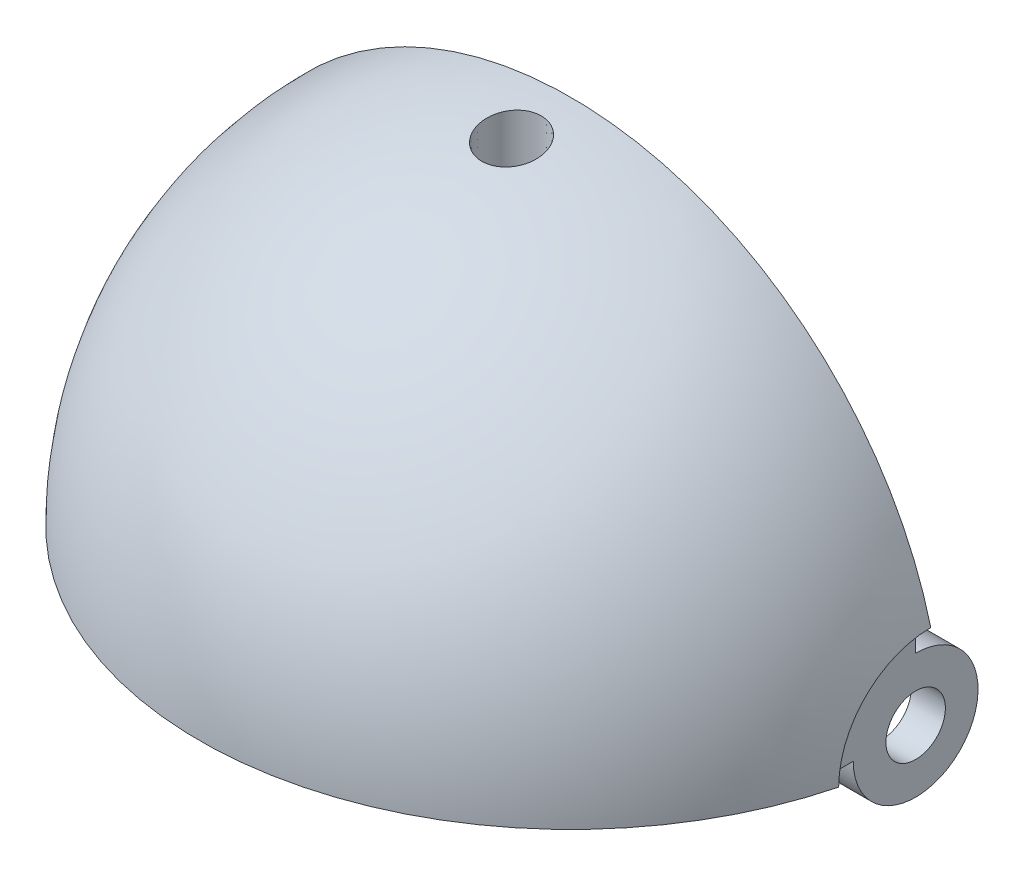
ISO-10303-21;
HEADER;
FILE_DESCRIPTION(('STEP AP214'),'2;1');
FILE_NAME('part.step','',(''),(''),'','','');
FILE_SCHEMA(('AUTOMOTIVE_DESIGN { 1 0 10303 214 1 1 1 1 }'));
ENDSEC;
DATA;
#1=APPLICATION_CONTEXT('core data for automotive mechanical design processes');
#2=APPLICATION_PROTOCOL_DEFINITION('international standard','automotive_design',2000,#1);
#3=PRODUCT_CONTEXT('',#1,'mechanical');
#4=PRODUCT('Part','Part','',(#3));
#5=PRODUCT_RELATED_PRODUCT_CATEGORY('part','',(#4));
#6=PRODUCT_DEFINITION_FORMATION('','',#4);
#7=PRODUCT_DEFINITION_CONTEXT('part definition',#1,'design');
#8=PRODUCT_DEFINITION('design','',#6,#7);
#9=PRODUCT_DEFINITION_SHAPE('','',#8);
#10=(LENGTH_UNIT() NAMED_UNIT(*) SI_UNIT(.MILLI.,.METRE.));
#11=(NAMED_UNIT(*) PLANE_ANGLE_UNIT() SI_UNIT($,.RADIAN.));
#12=(NAMED_UNIT(*) SI_UNIT($,.STERADIAN.) SOLID_ANGLE_UNIT());
#13=UNCERTAINTY_MEASURE_WITH_UNIT(LENGTH_MEASURE(1.E-05),#10,'distance_accuracy_value','');
#14=(GEOMETRIC_REPRESENTATION_CONTEXT(3) GLOBAL_UNCERTAINTY_ASSIGNED_CONTEXT((#13)) GLOBAL_UNIT_ASSIGNED_CONTEXT((#10,
#11,#12)) REPRESENTATION_CONTEXT('',''));
#15=CARTESIAN_POINT('',(0.,0.,0.));
#16=DIRECTION('',(0.,0.,1.));
#17=DIRECTION('',(1.,0.,0.));
#18=AXIS2_PLACEMENT_3D('',#15,#16,#17);
#19=CARTESIAN_POINT('',(0.,0.,0.));
#20=DIRECTION('',(-1.,0.,0.));
#21=DIRECTION('',(0.,0.,1.));
#22=AXIS2_PLACEMENT_3D('',#19,#20,#21);
#23=SPHERICAL_SURFACE('',#22,10.5);
#24=CARTESIAN_POINT('',(-10.4522724801834,0.,0.));
#25=DIRECTION('',(1.,0.,0.));
#26=DIRECTION('',(0.,0.,-1.));
#27=AXIS2_PLACEMENT_3D('',#24,#25,#26);
#28=CIRCLE('',#27,1.);
#29=CARTESIAN_POINT('',(-10.4522724801834,0.,-1.));
#30=VERTEX_POINT('',#29);
#31=EDGE_CURVE('E130',#30,#30,#28,.F.);
#32=ORIENTED_EDGE('',*,*,#31,.T.);
#33=EDGE_LOOP('',(#32));
#34=FACE_BOUND('',#33,.T.);
#35=CARTESIAN_POINT('',(0.,0.,0.));
#36=DIRECTION('',(0.,0.,-1.));
#37=DIRECTION('',(-1.,0.,0.));
#38=AXIS2_PLACEMENT_3D('',#35,#36,#37);
#39=CIRCLE('',#38,10.5);
#40=CARTESIAN_POINT('',(-10.2878569196893,2.10000000000001,0.));
#41=VERTEX_POINT('',#40);
#42=CARTESIAN_POINT('',(10.2878569196893,2.1,0.));
#43=VERTEX_POINT('',#42);
#44=EDGE_CURVE('E184',#41,#43,#39,.T.);
#45=ORIENTED_EDGE('',*,*,#44,.T.);
#46=CARTESIAN_POINT('',(10.2878569196893,0.,0.));
#47=DIRECTION('',(-1.,0.,0.));
#48=DIRECTION('',(0.,0.,1.));
#49=AXIS2_PLACEMENT_3D('',#46,#47,#48);
#50=CIRCLE('',#49,2.1);
#51=CARTESIAN_POINT('',(10.2878569196893,0.,2.1));
#52=VERTEX_POINT('',#51);
#53=EDGE_CURVE('E121',#43,#52,#50,.T.);
#54=ORIENTED_EDGE('',*,*,#53,.T.);
#55=CARTESIAN_POINT('',(0.,0.,0.));
#56=DIRECTION('',(0.,1.,0.));
#57=DIRECTION('',(-1.,0.,0.));
#58=AXIS2_PLACEMENT_3D('',#55,#56,#57);
#59=CIRCLE('',#58,10.5);
#60=CARTESIAN_POINT('',(-10.2878569196893,0.,2.10000000000001));
#61=VERTEX_POINT('',#60);
#62=EDGE_CURVE('E192',#61,#52,#59,.T.);
#63=ORIENTED_EDGE('',*,*,#62,.F.);
#64=CARTESIAN_POINT('',(-10.2878569196893,0.,0.));
#65=DIRECTION('',(1.,0.,0.));
#66=DIRECTION('',(0.,0.,-1.));
#67=AXIS2_PLACEMENT_3D('',#64,#65,#66);
#68=CIRCLE('',#67,2.1);
#69=EDGE_CURVE('E145',#41,#61,#68,.F.);
#70=ORIENTED_EDGE('',*,*,#69,.F.);
#71=EDGE_LOOP('',(#45,#54,#63,#70));
#72=FACE_BOUND('',#71,.T.);
#73=CARTESIAN_POINT('',(-0.728106991383491,10.3919129125039,1.31453649910791));
#74=CARTESIAN_POINT('',(-0.652307894969961,10.4074085480079,1.23402185176722));
#75=CARTESIAN_POINT('',(-0.561478176959268,10.4206443778854,1.16506705069624));
#76=CARTESIAN_POINT('',(-0.462887339683849,10.4305162135101,1.11358287992593));
#77=CARTESIAN_POINT('',(-0.364250911716371,10.4403926141008,1.06207490167979));
#78=CARTESIAN_POINT('',(-0.255100754894366,10.4471707095871,1.0266584289002));
#79=CARTESIAN_POINT('',(-0.14460436657346,10.4502611553673,1.01051044615525));
#80=CARTESIAN_POINT('',(-0.0352462698286744,10.4533197645559,0.994528813759015));
#81=CARTESIAN_POINT('',(0.0784601077623633,10.4528513834104,0.996978399371696));
#82=CARTESIAN_POINT('',(0.187002250838111,10.4488964939289,1.01764051479029));
#83=CARTESIAN_POINT('',(0.294964791327733,10.4449627231033,1.03819229688405));
#84=CARTESIAN_POINT('',(0.40077209243451,10.4374752988036,1.0773044496522));
#85=CARTESIAN_POINT('',(0.49584374268873,10.4270632028023,1.13158824119175));
#86=CARTESIAN_POINT('',(0.591491796704003,10.4165879799774,1.18620114642108));
#87=CARTESIAN_POINT('',(0.678870264824768,10.4028728288386,1.257621930668));
#88=CARTESIAN_POINT('',(0.751153575061501,10.387035668128,1.33987250725915));
#89=CARTESIAN_POINT('',(0.824512692668293,10.370962799698,1.4233472360951));
#90=CARTESIAN_POINT('',(0.884316341849243,10.3522731418889,1.52020831824258));
#91=CARTESIAN_POINT('',(0.926032704922112,10.3324621034353,1.62255672026828));
#92=CARTESIAN_POINT('',(0.968485093323489,10.3123015276536,1.72671091289207));
#93=CARTESIAN_POINT('',(0.993366785577458,10.2904329065453,1.83936667772853));
#94=CARTESIAN_POINT('',(0.998818202739425,10.2686128463832,1.9513975527737));
#95=CARTESIAN_POINT('',(1.00434101290862,10.2465070257175,2.06489560980735));
#96=CARTESIAN_POINT('',(0.990065393039273,10.2238424898462,2.18087510830186));
#97=CARTESIAN_POINT('',(0.957096018081167,10.2024955839191,2.28977096502786));
#98=CARTESIAN_POINT('',(0.924037202652325,10.1810907673607,2.39896223823352));
#99=CARTESIAN_POINT('',(0.871233389815047,10.1604138377774,2.50408003289963));
#100=CARTESIAN_POINT('',(0.802887925958877,10.1422620748597,2.59613000121572));
#101=CARTESIAN_POINT('',(0.73518303123678,10.1242804396783,2.68731722948779));
#102=CARTESIAN_POINT('',(0.650283830430682,10.1082734089357,2.76824168609916));
#103=CARTESIAN_POINT('',(0.555220685184941,10.0957014483491,2.83170306645026));
#104=CARTESIAN_POINT('',(0.461833592886861,10.08335114329,2.89404556278669));
#105=CARTESIAN_POINT('',(0.355984000525044,10.0739722451506,2.94127843993011));
#106=CARTESIAN_POINT('',(0.246643601730837,10.0684445163836,2.96910625512646));
#107=CARTESIAN_POINT('',(0.139251727918253,10.0630152957408,2.99643815853091));
#108=CARTESIAN_POINT('',(0.0254927193347815,10.0611509676927,3.00581118011393));
#109=CARTESIAN_POINT('',(-0.0850379033698531,10.0630258437454,2.99637771702827));
#110=CARTESIAN_POINT('',(-0.19450173363028,10.0648826243276,2.98703530153553));
#111=CARTESIAN_POINT('',(-0.303804673664861,10.0704538227887,2.95900922300621));
#112=CARTESIAN_POINT('',(-0.403994916017502,10.079233853829,2.91476122995676));
#113=CARTESIAN_POINT('',(-0.504473767317625,10.0880391767087,2.87038577572545));
#114=CARTESIAN_POINT('',(-0.598516598907779,10.1003035548544,2.80852073071121));
#115=CARTESIAN_POINT('',(-0.678723359369432,10.1149603979634,2.73439403690817));
#116=CARTESIAN_POINT('',(-0.760043725837227,10.129820739486,2.65923815390761));
#117=CARTESIAN_POINT('',(-0.829346013003156,10.1475346495717,2.56947620439639));
#118=CARTESIAN_POINT('',(-0.881354642215588,10.1666208184976,2.47245528322269));
#119=CARTESIAN_POINT('',(-0.934329948569716,10.1860617393849,2.37363104771087));
#120=CARTESIAN_POINT('',(-0.970806752228663,10.2074493688627,2.2646108261565));
#121=CARTESIAN_POINT('',(-0.988037665081139,10.2290346073549,2.15421275038404));
#122=CARTESIAN_POINT('',(-1.00552986754891,10.2509471644697,2.04214059785226));
#123=CARTESIAN_POINT('',(-1.00366237433522,10.273663734221,1.92557565916659));
#124=CARTESIAN_POINT('',(-0.982564264138022,10.2953238476762,1.81407671786753));
#125=CARTESIAN_POINT('',(-0.961356164594484,10.3170968803311,1.70199650670326));
#126=CARTESIAN_POINT('',(-0.920102408168955,10.3384092415675,1.59191448719013));
#127=CARTESIAN_POINT('',(-0.862043349156579,10.357477405828,1.49316544694061));
#128=CARTESIAN_POINT('',(-0.824395878875781,10.3698418526433,1.42913320767785));
#129=CARTESIAN_POINT('',(-0.779224092099755,10.3814630259195,1.36883365477313));
#130=CARTESIAN_POINT('',(-0.728106991383491,10.3919129125039,1.31453649910791));
#131=B_SPLINE_CURVE_WITH_KNOTS('',3,(#73,#74,#75,#76,#77,#78,#79,#80,#81,#82,#83,#84,#85,#86,
#87,#88,#89,#90,#91,#92,#93,#94,#95,#96,#97,#98,#99,#100,#101,#102,#103,#104,#105,#106,#107,
#108,#109,#110,#111,#112,#113,#114,#115,#116,#117,#118,#119,#120,#121,#122,#123,#124,#125,#126,
#127,#128,#129,#130),.UNSPECIFIED.,.T.,.F.,(4,3,3,3,3,3,3,3,3,3,3,3,3,3,3,3,3,3,3,4),(0.,
0.0530700565580793,0.106180479501993,0.158732982165884,0.210990223899904,0.263558239217251,
0.316913079120219,0.371222759247795,0.426261564827187,0.481464633769087,0.536154729250473,
0.589871347885317,0.64261232979514,0.694826104049307,0.747180409163166,0.800263579831544,
0.854346072192675,0.909266985583149,0.964490403462017,1.),.UNSPECIFIED.);
#132=CARTESIAN_POINT('',(-0.728106991383491,10.3919129125039,1.31453649910791));
#133=VERTEX_POINT('',#132);
#134=EDGE_CURVE('E153',#133,#133,#131,.T.);
#135=ORIENTED_EDGE('',*,*,#134,.F.);
#136=EDGE_LOOP('',(#135));
#137=FACE_BOUND('',#136,.T.);
#138=CARTESIAN_POINT('',(10.4522724801834,0.,0.));
#139=DIRECTION('',(-1.,0.,0.));
#140=DIRECTION('',(0.,0.,1.));
#141=AXIS2_PLACEMENT_3D('',#138,#139,#140);
#142=CIRCLE('',#141,1.);
#143=CARTESIAN_POINT('',(10.4522724801834,0.,1.));
#144=VERTEX_POINT('',#143);
#145=EDGE_CURVE('E111',#144,#144,#142,.T.);
#146=ORIENTED_EDGE('',*,*,#145,.F.);
#147=EDGE_LOOP('',(#146));
#148=FACE_BOUND('',#147,.T.);
#149=ADVANCED_FACE('F33',(#34,#72,#137,#148),#23,.F.);
#150=CARTESIAN_POINT('',(0.,0.,0.));
#151=DIRECTION('',(0.,1.,0.));
#152=DIRECTION('',(-1.,0.,0.));
#153=AXIS2_PLACEMENT_3D('',#150,#151,#152);
#154=PLANE('',#153);
#155=DIRECTION('',(1.,0.,0.));
#156=VECTOR('',#155,1.);
#157=CARTESIAN_POINT('',(-12.1105004025765,0.,2.1));
#158=LINE('',#157,#156);
#159=CARTESIAN_POINT('',(11.6,0.,2.1));
#160=VERTEX_POINT('',#159);
#161=EDGE_CURVE('E116',#52,#160,#158,.T.);
#162=ORIENTED_EDGE('',*,*,#161,.T.);
#163=DIRECTION('',(0.,0.,1.));
#164=VECTOR('',#163,1.);
#165=CARTESIAN_POINT('',(11.6,0.,0.));
#166=LINE('',#165,#164);
#167=CARTESIAN_POINT('',(11.6,0.,3.1));
#168=VERTEX_POINT('',#167);
#169=EDGE_CURVE('E108',#160,#168,#166,.T.);
#170=ORIENTED_EDGE('',*,*,#169,.T.);
#171=DIRECTION('',(1.,0.,0.));
#172=VECTOR('',#171,1.);
#173=CARTESIAN_POINT('',(-20.3681240867132,0.,3.1));
#174=LINE('',#173,#172);
#175=CARTESIAN_POINT('',(12.1095004025765,0.,3.1));
#176=VERTEX_POINT('',#175);
#177=EDGE_CURVE('E98',#168,#176,#174,.T.);
#178=ORIENTED_EDGE('',*,*,#177,.T.);
#179=CARTESIAN_POINT('',(0.,0.,0.));
#180=DIRECTION('',(0.,-1.,0.));
#181=DIRECTION('',(-1.,0.,0.));
#182=AXIS2_PLACEMENT_3D('',#179,#180,#181);
#183=CIRCLE('',#182,12.5);
#184=CARTESIAN_POINT('',(-12.1095004025765,0.,3.1));
#185=VERTEX_POINT('',#184);
#186=EDGE_CURVE('E56',#176,#185,#183,.T.);
#187=ORIENTED_EDGE('',*,*,#186,.T.);
#188=DIRECTION('',(-1.,0.,0.));
#189=VECTOR('',#188,1.);
#190=CARTESIAN_POINT('',(-2.83187591328681,0.,3.1));
#191=LINE('',#190,#189);
#192=CARTESIAN_POINT('',(-11.6,0.,3.1));
#193=VERTEX_POINT('',#192);
#194=EDGE_CURVE('E143',#193,#185,#191,.T.);
#195=ORIENTED_EDGE('',*,*,#194,.F.);
#196=DIRECTION('',(0.,0.,-1.));
#197=VECTOR('',#196,1.);
#198=CARTESIAN_POINT('',(-11.6,0.,0.));
#199=LINE('',#198,#197);
#200=CARTESIAN_POINT('',(-11.6,0.,2.1));
#201=VERTEX_POINT('',#200);
#202=EDGE_CURVE('E136',#193,#201,#199,.T.);
#203=ORIENTED_EDGE('',*,*,#202,.T.);
#204=DIRECTION('',(-1.,0.,0.));
#205=VECTOR('',#204,1.);
#206=CARTESIAN_POINT('',(12.501,0.,2.1));
#207=LINE('',#206,#205);
#208=EDGE_CURVE('E150',#61,#201,#207,.T.);
#209=ORIENTED_EDGE('',*,*,#208,.F.);
#210=ORIENTED_EDGE('',*,*,#62,.T.);
#211=EDGE_LOOP('',(#162,#170,#178,#187,#195,#203,#209,#210));
#212=FACE_BOUND('',#211,.T.);
#213=ADVANCED_FACE('F114',(#212),#154,.F.);
#214=CARTESIAN_POINT('',(0.,0.,0.));
#215=DIRECTION('',(0.,0.,-1.));
#216=DIRECTION('',(-1.,0.,0.));
#217=AXIS2_PLACEMENT_3D('',#214,#215,#216);
#218=PLANE('',#217);
#219=DIRECTION('',(0.,1.,0.));
#220=VECTOR('',#219,1.);
#221=CARTESIAN_POINT('',(11.6,0.,0.));
#222=LINE('',#221,#220);
#223=CARTESIAN_POINT('',(11.6,2.1,0.));
#224=VERTEX_POINT('',#223);
#225=CARTESIAN_POINT('',(11.6,3.1,0.));
#226=VERTEX_POINT('',#225);
#227=EDGE_CURVE('E110',#224,#226,#222,.T.);
#228=ORIENTED_EDGE('',*,*,#227,.F.);
#229=DIRECTION('',(1.,0.,0.));
#230=VECTOR('',#229,1.);
#231=CARTESIAN_POINT('',(-12.1105004025765,2.1,0.));
#232=LINE('',#231,#230);
#233=EDGE_CURVE('E124',#43,#224,#232,.T.);
#234=ORIENTED_EDGE('',*,*,#233,.F.);
#235=ORIENTED_EDGE('',*,*,#44,.F.);
#236=DIRECTION('',(-1.,0.,0.));
#237=VECTOR('',#236,1.);
#238=CARTESIAN_POINT('',(12.501,2.1,0.));
#239=LINE('',#238,#237);
#240=CARTESIAN_POINT('',(-11.6,2.1,0.));
#241=VERTEX_POINT('',#240);
#242=EDGE_CURVE('E195',#41,#241,#239,.T.);
#243=ORIENTED_EDGE('',*,*,#242,.T.);
#244=DIRECTION('',(0.,-1.,0.));
#245=VECTOR('',#244,1.);
#246=CARTESIAN_POINT('',(-11.6,0.,0.));
#247=LINE('',#246,#245);
#248=CARTESIAN_POINT('',(-11.6,3.1,0.));
#249=VERTEX_POINT('',#248);
#250=EDGE_CURVE('E137',#249,#241,#247,.T.);
#251=ORIENTED_EDGE('',*,*,#250,.F.);
#252=DIRECTION('',(-1.,0.,0.));
#253=VECTOR('',#252,1.);
#254=CARTESIAN_POINT('',(-2.83187591328681,3.1,0.));
#255=LINE('',#254,#253);
#256=CARTESIAN_POINT('',(-12.1095004025765,3.1,0.));
#257=VERTEX_POINT('',#256);
#258=EDGE_CURVE('E139',#249,#257,#255,.T.);
#259=ORIENTED_EDGE('',*,*,#258,.T.);
#260=CARTESIAN_POINT('',(0.,0.,0.));
#261=DIRECTION('',(0.,0.,1.));
#262=DIRECTION('',(-1.,0.,0.));
#263=AXIS2_PLACEMENT_3D('',#260,#261,#262);
#264=CIRCLE('',#263,12.5);
#265=CARTESIAN_POINT('',(12.1095004025765,3.1,0.));
#266=VERTEX_POINT('',#265);
#267=EDGE_CURVE('E190',#266,#257,#264,.T.);
#268=ORIENTED_EDGE('',*,*,#267,.F.);
#269=DIRECTION('',(1.,0.,0.));
#270=VECTOR('',#269,1.);
#271=CARTESIAN_POINT('',(-20.3681240867132,3.1,0.));
#272=LINE('',#271,#270);
#273=EDGE_CURVE('E49',#226,#266,#272,.T.);
#274=ORIENTED_EDGE('',*,*,#273,.F.);
#275=EDGE_LOOP('',(#228,#234,#235,#243,#251,#259,#268,#274));
#276=FACE_BOUND('',#275,.T.);
#277=ADVANCED_FACE('F213',(#276),#218,.T.);
#278=CARTESIAN_POINT('',(0.,0.,0.));
#279=DIRECTION('',(-1.,0.,0.));
#280=DIRECTION('',(0.,0.,1.));
#281=AXIS2_PLACEMENT_3D('',#278,#279,#280);
#282=SPHERICAL_SURFACE('',#281,12.5);
#283=CARTESIAN_POINT('',(-0.728106991383491,12.4093454300221,1.31453649910791));
#284=CARTESIAN_POINT('',(-0.689899610551344,12.415884066346,1.27397222106609));
#285=CARTESIAN_POINT('',(-0.648173094268771,12.4219102592478,1.23659496825361));
#286=CARTESIAN_POINT('',(-0.55906422900722,12.4327709178177,1.16910693265255));
#287=CARTESIAN_POINT('',(-0.511680254296422,12.437605039702,1.13899824611258));
#288=CARTESIAN_POINT('',(-0.412353040336046,12.4459224410411,1.08725928283271));
#289=CARTESIAN_POINT('',(-0.360408103724934,12.4494052149565,1.06563217902059));
#290=CARTESIAN_POINT('',(-0.253617181376355,12.4549390148278,1.03117765100777));
#291=CARTESIAN_POINT('',(-0.198771911710647,12.4569903924264,1.01834806558646));
#292=CARTESIAN_POINT('',(-0.0880748302830937,12.4595619958497,1.00232909902844));
#293=CARTESIAN_POINT('',(-0.0322335871521187,12.4600935361527,0.99906847660882));
#294=CARTESIAN_POINT('',(0.0792285518691048,12.4596729101595,1.00168931687051));
#295=CARTESIAN_POINT('',(0.134849447157652,12.4587207398146,1.00757080449886));
#296=CARTESIAN_POINT('',(0.244026953620121,12.4553371718485,1.02864408920243));
#297=CARTESIAN_POINT('',(0.29759072297998,12.4529115153133,1.04379975334889));
#298=CARTESIAN_POINT('',(0.401479612173663,12.4466845138338,1.08256293164331));
#299=CARTESIAN_POINT('',(0.451804702289858,12.4428831562684,1.10617052333183));
#300=CARTESIAN_POINT('',(0.54787093879884,12.4339715811213,1.16159203959725));
#301=CARTESIAN_POINT('',(0.593591699324328,12.4288558707922,1.19344040686471));
#302=CARTESIAN_POINT('',(0.679170972209115,12.4174877254039,1.26405528920664));
#303=CARTESIAN_POINT('',(0.719029208219901,12.4112352367902,1.30282213021457));
#304=CARTESIAN_POINT('',(0.791955136214635,12.3976848427621,1.38686393646583));
#305=CARTESIAN_POINT('',(0.824946710240552,12.3903765991633,1.4322032784376));
#306=CARTESIAN_POINT('',(0.883027295346548,12.3749738947431,1.52756693650976));
#307=CARTESIAN_POINT('',(0.908115775086694,12.3668793811072,1.57759156731775));
#308=CARTESIAN_POINT('',(0.949678259099593,12.3500255371919,1.68173552125069));
#309=CARTESIAN_POINT('',(0.966041112847829,12.3412591840371,1.73589807290691));
#310=CARTESIAN_POINT('',(0.989601124777249,12.3233826805889,1.84612721237754));
#311=CARTESIAN_POINT('',(0.996797758090051,12.3142725106389,1.90219390903679));
#312=CARTESIAN_POINT('',(1.00149571275093,12.2958998811178,2.01523360381635));
#313=CARTESIAN_POINT('',(0.998908133164669,12.2866367902316,2.07221020549165));
#314=CARTESIAN_POINT('',(0.984287818216278,12.2682685782145,2.18496681495122));
#315=CARTESIAN_POINT('',(0.972254859888823,12.2591634608179,2.2407467944564));
#316=CARTESIAN_POINT('',(0.938649775224896,12.2414018079302,2.34954132258098));
#317=CARTESIAN_POINT('',(0.917061065192044,12.2327460816496,2.402550883623));
#318=CARTESIAN_POINT('',(0.865288659641871,12.2160976013223,2.50430880913818));
#319=CARTESIAN_POINT('',(0.835105177423509,12.2081048308292,2.55305727932083));
#320=CARTESIAN_POINT('',(0.766844266202561,12.1931417448155,2.64433857605511));
#321=CARTESIAN_POINT('',(0.728820491320502,12.1861650028076,2.68691046310065));
#322=CARTESIAN_POINT('',(0.646122966377359,12.173306844395,2.76521406180111));
#323=CARTESIAN_POINT('',(0.601449648074106,12.1674253569306,2.80094621721878));
#324=CARTESIAN_POINT('',(0.507038350238937,12.1570958445774,2.86376235057631));
#325=CARTESIAN_POINT('',(0.457369112855797,12.1526311431459,2.89094690191247));
#326=CARTESIAN_POINT('',(0.354139426302769,12.1450857408511,2.93678062576638));
#327=CARTESIAN_POINT('',(0.300579268297489,12.142004936552,2.95543043619337));
#328=CARTESIAN_POINT('',(0.191659847653857,12.1374548535898,2.98304861424364));
#329=CARTESIAN_POINT('',(0.13633100767732,12.135966125469,2.99213380530917));
#330=CARTESIAN_POINT('',(0.0249140844680925,12.1344809453725,3.00114568263772));
#331=CARTESIAN_POINT('',(-0.0311739619784159,12.1344844213513,3.00107281106355));
#332=CARTESIAN_POINT('',(-0.142116136804545,12.1360774388554,2.991405613831));
#333=CARTESIAN_POINT('',(-0.196976049598955,12.1376562376509,2.98187578121465));
#334=CARTESIAN_POINT('',(-0.304365833323193,12.1422382561654,2.95406388345172));
#335=CARTESIAN_POINT('',(-0.356895712168634,12.1452414710449,2.93578184804069));
#336=CARTESIAN_POINT('',(-0.458126920244492,12.1526761844285,2.89061804615184));
#337=CARTESIAN_POINT('',(-0.506820860889904,12.157110359339,2.86372016567114));
#338=CARTESIAN_POINT('',(-0.599117041600928,12.167185043795,2.80245619165245));
#339=CARTESIAN_POINT('',(-0.642719059812294,12.1728256058724,2.76808977289794));
#340=CARTESIAN_POINT('',(-0.723820467898995,12.1852809748719,2.69224115097837));
#341=CARTESIAN_POINT('',(-0.761257432008704,12.1921065073881,2.65069396897165));
#342=CARTESIAN_POINT('',(-0.828796418647627,12.2066230486477,2.56214832865606));
#343=CARTESIAN_POINT('',(-0.85889793681649,12.2143141168493,2.51514949583793));
#344=CARTESIAN_POINT('',(-0.911015352438692,12.2305064314308,2.41619472566527));
#345=CARTESIAN_POINT('',(-0.932921426975097,12.2390168843567,2.36418244777759));
#346=CARTESIAN_POINT('',(-0.967860330347143,12.2564656731408,2.25732845223746));
#347=CARTESIAN_POINT('',(-0.980892934750528,12.2654040198153,2.20248666305734));
#348=CARTESIAN_POINT('',(-0.997479854750457,12.2835971034336,2.09083201973493));
#349=CARTESIAN_POINT('',(-1.00093287854682,12.2928541814051,2.03400448780989));
#350=CARTESIAN_POINT('',(-0.998353945094159,12.3113010028108,1.92053719231382));
#351=CARTESIAN_POINT('',(-0.992319358972978,12.3204907268734,1.86389748514424));
#352=CARTESIAN_POINT('',(-0.970499021284551,12.3386008373284,1.75225340936501));
#353=CARTESIAN_POINT('',(-0.954675751143951,12.3475200482414,1.69725619044849));
#354=CARTESIAN_POINT('',(-0.91402331664227,12.3647826864806,1.59060897525168));
#355=CARTESIAN_POINT('',(-0.88919829526075,12.3731263765862,1.53895745201201));
#356=CARTESIAN_POINT('',(-0.841408005010492,12.386146707887,1.45834525805561));
#357=CARTESIAN_POINT('',(-0.820976685075921,12.3910641669102,1.42789738919229));
#358=CARTESIAN_POINT('',(-0.776908063611606,12.4005103203657,1.369351041479));
#359=CARTESIAN_POINT('',(-0.753270771155419,12.405039015898,1.34125255598016));
#360=CARTESIAN_POINT('',(-0.728106991383491,12.4093454300221,1.31453649910791));
#361=B_SPLINE_CURVE_WITH_KNOTS('',3,(#283,#284,#285,#286,#287,#288,#289,#290,#291,#292,#293,
#294,#295,#296,#297,#298,#299,#300,#301,#302,#303,#304,#305,#306,#307,#308,#309,#310,#311,#312,
#313,#314,#315,#316,#317,#318,#319,#320,#321,#322,#323,#324,#325,#326,#327,#328,#329,#330,#331,
#332,#333,#334,#335,#336,#337,#338,#339,#340,#341,#342,#343,#344,#345,#346,#347,#348,#349,#350,
#351,#352,#353,#354,#355,#356,#357,#358,#359,#360),.UNSPECIFIED.,.T.,.F.,(4,2,2,2,2,2,2,2,2,2,2,
2,2,2,2,2,2,2,2,2,2,2,2,2,2,2,2,2,2,2,2,2,2,2,2,2,2,2,4),(0.,0.168202618158534,
0.336453688018412,0.504767640058224,0.67304022883962,0.840056803397201,1.00707383371123,
1.17344425918152,1.33981621102398,1.50689508131306,1.67398182486735,1.84283223989981,
2.01169400464243,2.18265830904687,2.35363240262504,2.52616371139558,2.69869909302093,
2.87153508542734,3.04436678888646,3.21605281650582,3.38772770133348,3.55729967309864,
3.72685896853259,3.89432232840623,4.06177760294096,4.22809868723908,4.39441920646646,
4.56105262515407,4.72769330132652,4.89592945722275,5.06417717720408,5.23460495824474,
5.4050370496702,5.57726449617931,5.74953967270101,5.9224792808756,6.09533939587977,
6.20611970918993,6.31689970897577),.UNSPECIFIED.);
#362=CARTESIAN_POINT('',(-0.728106991383491,12.4093454300221,1.31453649910791));
#363=VERTEX_POINT('',#362);
#364=EDGE_CURVE('E181',#363,#363,#361,.T.);
#365=ORIENTED_EDGE('',*,*,#364,.T.);
#366=EDGE_LOOP('',(#365));
#367=FACE_BOUND('',#366,.T.);
#368=ORIENTED_EDGE('',*,*,#186,.F.);
#369=CARTESIAN_POINT('',(12.1095004025765,0.,0.));
#370=DIRECTION('',(-1.,0.,0.));
#371=DIRECTION('',(0.,0.,1.));
#372=AXIS2_PLACEMENT_3D('',#369,#370,#371);
#373=CIRCLE('',#372,3.1);
#374=EDGE_CURVE('E11',#176,#266,#373,.T.);
#375=ORIENTED_EDGE('',*,*,#374,.T.);
#376=ORIENTED_EDGE('',*,*,#267,.T.);
#377=CARTESIAN_POINT('',(-12.1095004025765,0.,0.));
#378=DIRECTION('',(1.,0.,0.));
#379=DIRECTION('',(0.,0.,-1.));
#380=AXIS2_PLACEMENT_3D('',#377,#378,#379);
#381=CIRCLE('',#380,3.1);
#382=EDGE_CURVE('E42',#185,#257,#381,.F.);
#383=ORIENTED_EDGE('',*,*,#382,.F.);
#384=EDGE_LOOP('',(#368,#375,#376,#383));
#385=FACE_BOUND('',#384,.T.);
#386=ADVANCED_FACE('F35',(#367,#385),#282,.T.);
#387=CARTESIAN_POINT('',(-0.728106991383491,10.3919129125039,1.31453649910791));
#388=CARTESIAN_POINT('',(-0.652307894969961,10.4074085480079,1.23402185176722));
#389=CARTESIAN_POINT('',(-0.561478176959268,10.4206443778854,1.16506705069624));
#390=CARTESIAN_POINT('',(-0.462887339683849,10.4305162135101,1.11358287992593));
#391=CARTESIAN_POINT('',(-0.364250911716371,10.4403926141008,1.06207490167979));
#392=CARTESIAN_POINT('',(-0.255100754894366,10.4471707095871,1.0266584289002));
#393=CARTESIAN_POINT('',(-0.14460436657346,10.4502611553673,1.01051044615525));
#394=CARTESIAN_POINT('',(-0.0352462698286744,10.4533197645559,0.994528813759015));
#395=CARTESIAN_POINT('',(0.0784601077623633,10.4528513834104,0.996978399371696));
#396=CARTESIAN_POINT('',(0.187002250838111,10.4488964939289,1.01764051479029));
#397=CARTESIAN_POINT('',(0.294964791327733,10.4449627231033,1.03819229688405));
#398=CARTESIAN_POINT('',(0.40077209243451,10.4374752988036,1.0773044496522));
#399=CARTESIAN_POINT('',(0.49584374268873,10.4270632028023,1.13158824119175));
#400=CARTESIAN_POINT('',(0.591491796704003,10.4165879799774,1.18620114642108));
#401=CARTESIAN_POINT('',(0.678870264824768,10.4028728288386,1.257621930668));
#402=CARTESIAN_POINT('',(0.751153575061501,10.387035668128,1.33987250725915));
#403=CARTESIAN_POINT('',(0.824512692668293,10.370962799698,1.4233472360951));
#404=CARTESIAN_POINT('',(0.884316341849243,10.3522731418889,1.52020831824258));
#405=CARTESIAN_POINT('',(0.926032704922112,10.3324621034353,1.62255672026828));
#406=CARTESIAN_POINT('',(0.968485093323489,10.3123015276536,1.72671091289207));
#407=CARTESIAN_POINT('',(0.993366785577458,10.2904329065453,1.83936667772853));
#408=CARTESIAN_POINT('',(0.998818202739425,10.2686128463832,1.9513975527737));
#409=CARTESIAN_POINT('',(1.00434101290862,10.2465070257175,2.06489560980735));
#410=CARTESIAN_POINT('',(0.990065393039273,10.2238424898462,2.18087510830186));
#411=CARTESIAN_POINT('',(0.957096018081167,10.2024955839191,2.28977096502786));
#412=CARTESIAN_POINT('',(0.924037202652325,10.1810907673607,2.39896223823352));
#413=CARTESIAN_POINT('',(0.871233389815047,10.1604138377774,2.50408003289963));
#414=CARTESIAN_POINT('',(0.802887925958877,10.1422620748597,2.59613000121572));
#415=CARTESIAN_POINT('',(0.73518303123678,10.1242804396783,2.68731722948779));
#416=CARTESIAN_POINT('',(0.650283830430682,10.1082734089357,2.76824168609916));
#417=CARTESIAN_POINT('',(0.555220685184941,10.0957014483491,2.83170306645026));
#418=CARTESIAN_POINT('',(0.461833592886861,10.08335114329,2.89404556278669));
#419=CARTESIAN_POINT('',(0.355984000525044,10.0739722451506,2.94127843993011));
#420=CARTESIAN_POINT('',(0.246643601730837,10.0684445163836,2.96910625512646));
#421=CARTESIAN_POINT('',(0.139251727918253,10.0630152957408,2.99643815853091));
#422=CARTESIAN_POINT('',(0.0254927193347815,10.0611509676927,3.00581118011393));
#423=CARTESIAN_POINT('',(-0.0850379033698531,10.0630258437454,2.99637771702827));
#424=CARTESIAN_POINT('',(-0.19450173363028,10.0648826243276,2.98703530153553));
#425=CARTESIAN_POINT('',(-0.303804673664861,10.0704538227887,2.95900922300621));
#426=CARTESIAN_POINT('',(-0.403994916017502,10.079233853829,2.91476122995676));
#427=CARTESIAN_POINT('',(-0.504473767317625,10.0880391767087,2.87038577572545));
#428=CARTESIAN_POINT('',(-0.598516598907779,10.1003035548544,2.80852073071121));
#429=CARTESIAN_POINT('',(-0.678723359369432,10.1149603979634,2.73439403690817));
#430=CARTESIAN_POINT('',(-0.760043725837227,10.129820739486,2.65923815390761));
#431=CARTESIAN_POINT('',(-0.829346013003156,10.1475346495717,2.56947620439639));
#432=CARTESIAN_POINT('',(-0.881354642215588,10.1666208184976,2.47245528322269));
#433=CARTESIAN_POINT('',(-0.934329948569716,10.1860617393849,2.37363104771087));
#434=CARTESIAN_POINT('',(-0.970806752228663,10.2074493688627,2.2646108261565));
#435=CARTESIAN_POINT('',(-0.988037665081139,10.2290346073549,2.15421275038404));
#436=CARTESIAN_POINT('',(-1.00552986754891,10.2509471644697,2.04214059785226));
#437=CARTESIAN_POINT('',(-1.00366237433522,10.273663734221,1.92557565916659));
#438=CARTESIAN_POINT('',(-0.982564264138022,10.2953238476762,1.81407671786753));
#439=CARTESIAN_POINT('',(-0.961356164594484,10.3170968803311,1.70199650670326));
#440=CARTESIAN_POINT('',(-0.920102408168955,10.3384092415675,1.59191448719013));
#441=CARTESIAN_POINT('',(-0.862043349156579,10.357477405828,1.49316544694061));
#442=CARTESIAN_POINT('',(-0.824395878875781,10.3698418526433,1.42913320767785));
#443=CARTESIAN_POINT('',(-0.779224092099755,10.3814630259195,1.36883365477313));
#444=CARTESIAN_POINT('',(-0.728106991383491,10.3919129125039,1.31453649910791));
#445=B_SPLINE_CURVE_WITH_KNOTS('',3,(#387,#388,#389,#390,#391,#392,#393,#394,#395,#396,#397,
#398,#399,#400,#401,#402,#403,#404,#405,#406,#407,#408,#409,#410,#411,#412,#413,#414,#415,#416,
#417,#418,#419,#420,#421,#422,#423,#424,#425,#426,#427,#428,#429,#430,#431,#432,#433,#434,#435,
#436,#437,#438,#439,#440,#441,#442,#443,#444),.UNSPECIFIED.,.T.,.F.,(4,3,3,3,3,3,3,3,3,3,3,3,3,
3,3,3,3,3,3,4),(0.,0.0530700565580793,0.106180479501993,0.158732982165884,0.210990223899904,
0.263558239217251,0.316913079120219,0.371222759247795,0.426261564827187,0.481464633769087,
0.536154729250473,0.589871347885317,0.64261232979514,0.694826104049307,0.747180409163166,
0.800263579831544,0.854346072192675,0.909266985583149,0.964490403462017,1.),.UNSPECIFIED.);
#446=DIRECTION('',(0.,1.,0.));
#447=VECTOR('',#446,1.);
#448=SURFACE_OF_LINEAR_EXTRUSION('',#445,#447);
#449=ORIENTED_EDGE('',*,*,#364,.F.);
#450=EDGE_LOOP('',(#449));
#451=FACE_BOUND('',#450,.T.);
#452=ORIENTED_EDGE('',*,*,#134,.T.);
#453=EDGE_LOOP('',(#452));
#454=FACE_BOUND('',#453,.T.);
#455=ADVANCED_FACE('F160',(#451,#454),#448,.T.);
#456=CARTESIAN_POINT('',(12.501,0.,0.));
#457=DIRECTION('',(-1.,0.,0.));
#458=DIRECTION('',(0.,0.,1.));
#459=AXIS2_PLACEMENT_3D('',#456,#457,#458);
#460=CYLINDRICAL_SURFACE('',#459,2.1);
#461=ORIENTED_EDGE('',*,*,#69,.T.);
#462=ORIENTED_EDGE('',*,*,#208,.T.);
#463=CARTESIAN_POINT('',(-11.6,0.,0.));
#464=DIRECTION('',(1.,0.,0.));
#465=DIRECTION('',(0.,0.,-1.));
#466=AXIS2_PLACEMENT_3D('',#463,#464,#465);
#467=CIRCLE('',#466,2.1);
#468=EDGE_CURVE('E147',#201,#241,#467,.T.);
#469=ORIENTED_EDGE('',*,*,#468,.T.);
#470=ORIENTED_EDGE('',*,*,#242,.F.);
#471=EDGE_LOOP('',(#461,#462,#469,#470));
#472=FACE_BOUND('',#471,.T.);
#473=ADVANCED_FACE('F171',(#472),#460,.T.);
#474=CARTESIAN_POINT('',(-11.6,0.,0.));
#475=DIRECTION('',(1.,0.,0.));
#476=DIRECTION('',(0.,0.,-1.));
#477=AXIS2_PLACEMENT_3D('',#474,#475,#476);
#478=PLANE('',#477);
#479=CARTESIAN_POINT('',(-11.6,0.,0.));
#480=DIRECTION('',(1.,0.,0.));
#481=DIRECTION('',(0.,0.,-1.));
#482=AXIS2_PLACEMENT_3D('',#479,#480,#481);
#483=CIRCLE('',#482,1.);
#484=CARTESIAN_POINT('',(-11.6,0.,-1.));
#485=VERTEX_POINT('',#484);
#486=EDGE_CURVE('E129',#485,#485,#483,.T.);
#487=ORIENTED_EDGE('',*,*,#486,.T.);
#488=EDGE_LOOP('',(#487));
#489=FACE_BOUND('',#488,.T.);
#490=ORIENTED_EDGE('',*,*,#468,.F.);
#491=ORIENTED_EDGE('',*,*,#202,.F.);
#492=CARTESIAN_POINT('',(-11.6,0.,0.));
#493=DIRECTION('',(1.,0.,0.));
#494=DIRECTION('',(0.,0.,-1.));
#495=AXIS2_PLACEMENT_3D('',#492,#493,#494);
#496=CIRCLE('',#495,3.1);
#497=EDGE_CURVE('E133',#249,#193,#496,.T.);
#498=ORIENTED_EDGE('',*,*,#497,.F.);
#499=ORIENTED_EDGE('',*,*,#250,.T.);
#500=EDGE_LOOP('',(#490,#491,#498,#499));
#501=FACE_BOUND('',#500,.T.);
#502=ADVANCED_FACE('F233',(#489,#501),#478,.F.);
#503=CARTESIAN_POINT('',(-2.83187591328681,0.,0.));
#504=DIRECTION('',(-1.,0.,0.));
#505=DIRECTION('',(0.,0.,1.));
#506=AXIS2_PLACEMENT_3D('',#503,#504,#505);
#507=CYLINDRICAL_SURFACE('',#506,3.1);
#508=ORIENTED_EDGE('',*,*,#194,.T.);
#509=ORIENTED_EDGE('',*,*,#382,.T.);
#510=ORIENTED_EDGE('',*,*,#258,.F.);
#511=ORIENTED_EDGE('',*,*,#497,.T.);
#512=EDGE_LOOP('',(#508,#509,#510,#511));
#513=FACE_BOUND('',#512,.T.);
#514=ADVANCED_FACE('F247',(#513),#507,.F.);
#515=CARTESIAN_POINT('',(-12.1095004025765,0.,0.));
#516=DIRECTION('',(1.,0.,0.));
#517=DIRECTION('',(0.,0.,-1.));
#518=AXIS2_PLACEMENT_3D('',#515,#516,#517);
#519=CYLINDRICAL_SURFACE('',#518,1.);
#520=ORIENTED_EDGE('',*,*,#486,.F.);
#521=EDGE_LOOP('',(#520));
#522=FACE_BOUND('',#521,.T.);
#523=ORIENTED_EDGE('',*,*,#31,.F.);
#524=EDGE_LOOP('',(#523));
#525=FACE_BOUND('',#524,.T.);
#526=ADVANCED_FACE('F244',(#522,#525),#519,.F.);
#527=CARTESIAN_POINT('',(11.6,0.,0.));
#528=DIRECTION('',(-1.,0.,0.));
#529=DIRECTION('',(0.,0.,-1.));
#530=AXIS2_PLACEMENT_3D('',#527,#528,#529);
#531=PLANE('',#530);
#532=CARTESIAN_POINT('',(11.6,0.,0.));
#533=DIRECTION('',(-1.,0.,0.));
#534=DIRECTION('',(0.,0.,1.));
#535=AXIS2_PLACEMENT_3D('',#532,#533,#534);
#536=CIRCLE('',#535,1.);
#537=CARTESIAN_POINT('',(11.6,0.,1.));
#538=VERTEX_POINT('',#537);
#539=EDGE_CURVE('E37',#538,#538,#536,.F.);
#540=ORIENTED_EDGE('',*,*,#539,.F.);
#541=EDGE_LOOP('',(#540));
#542=FACE_BOUND('',#541,.T.);
#543=ORIENTED_EDGE('',*,*,#169,.F.);
#544=CARTESIAN_POINT('',(11.6,0.,0.));
#545=DIRECTION('',(1.,0.,0.));
#546=DIRECTION('',(0.,0.,-1.));
#547=AXIS2_PLACEMENT_3D('',#544,#545,#546);
#548=CIRCLE('',#547,2.1);
#549=EDGE_CURVE('E103',#160,#224,#548,.T.);
#550=ORIENTED_EDGE('',*,*,#549,.T.);
#551=ORIENTED_EDGE('',*,*,#227,.T.);
#552=CARTESIAN_POINT('',(11.6,0.,0.));
#553=DIRECTION('',(-1.,0.,0.));
#554=DIRECTION('',(0.,0.,1.));
#555=AXIS2_PLACEMENT_3D('',#552,#553,#554);
#556=CIRCLE('',#555,3.1);
#557=EDGE_CURVE('E101',#226,#168,#556,.F.);
#558=ORIENTED_EDGE('',*,*,#557,.T.);
#559=EDGE_LOOP('',(#543,#550,#551,#558));
#560=FACE_BOUND('',#559,.T.);
#561=ADVANCED_FACE('F106',(#542,#560),#531,.F.);
#562=CARTESIAN_POINT('',(-12.1105004025765,0.,0.));
#563=DIRECTION('',(1.,0.,0.));
#564=DIRECTION('',(0.,0.,-1.));
#565=AXIS2_PLACEMENT_3D('',#562,#563,#564);
#566=CYLINDRICAL_SURFACE('',#565,2.1);
#567=ORIENTED_EDGE('',*,*,#161,.F.);
#568=ORIENTED_EDGE('',*,*,#53,.F.);
#569=ORIENTED_EDGE('',*,*,#233,.T.);
#570=ORIENTED_EDGE('',*,*,#549,.F.);
#571=EDGE_LOOP('',(#567,#568,#569,#570));
#572=FACE_BOUND('',#571,.T.);
#573=ADVANCED_FACE('F224',(#572),#566,.T.);
#574=CARTESIAN_POINT('',(-20.3681240867132,0.,0.));
#575=DIRECTION('',(1.,0.,0.));
#576=DIRECTION('',(0.,0.,-1.));
#577=AXIS2_PLACEMENT_3D('',#574,#575,#576);
#578=CYLINDRICAL_SURFACE('',#577,3.1);
#579=ORIENTED_EDGE('',*,*,#557,.F.);
#580=ORIENTED_EDGE('',*,*,#273,.T.);
#581=ORIENTED_EDGE('',*,*,#374,.F.);
#582=ORIENTED_EDGE('',*,*,#177,.F.);
#583=EDGE_LOOP('',(#579,#580,#581,#582));
#584=FACE_BOUND('',#583,.T.);
#585=ADVANCED_FACE('F100',(#584),#578,.F.);
#586=CARTESIAN_POINT('',(12.1095004025765,0.,0.));
#587=DIRECTION('',(-1.,0.,0.));
#588=DIRECTION('',(0.,0.,1.));
#589=AXIS2_PLACEMENT_3D('',#586,#587,#588);
#590=CYLINDRICAL_SURFACE('',#589,1.);
#591=ORIENTED_EDGE('',*,*,#539,.T.);
#592=EDGE_LOOP('',(#591));
#593=FACE_BOUND('',#592,.T.);
#594=ORIENTED_EDGE('',*,*,#145,.T.);
#595=EDGE_LOOP('',(#594));
#596=FACE_BOUND('',#595,.T.);
#597=ADVANCED_FACE('F300',(#593,#596),#590,.F.);
#598=CLOSED_SHELL('',(#149,#213,#277,#386,#455,#473,#502,#514,#526,#561,#573,#585,#597));
#599=MANIFOLD_SOLID_BREP('B2',#598);
#600=ADVANCED_BREP_SHAPE_REPRESENTATION('',(#18,#599),#14);
#601=SHAPE_DEFINITION_REPRESENTATION(#9,#600);
ENDSEC;
END-ISO-10303-21;
